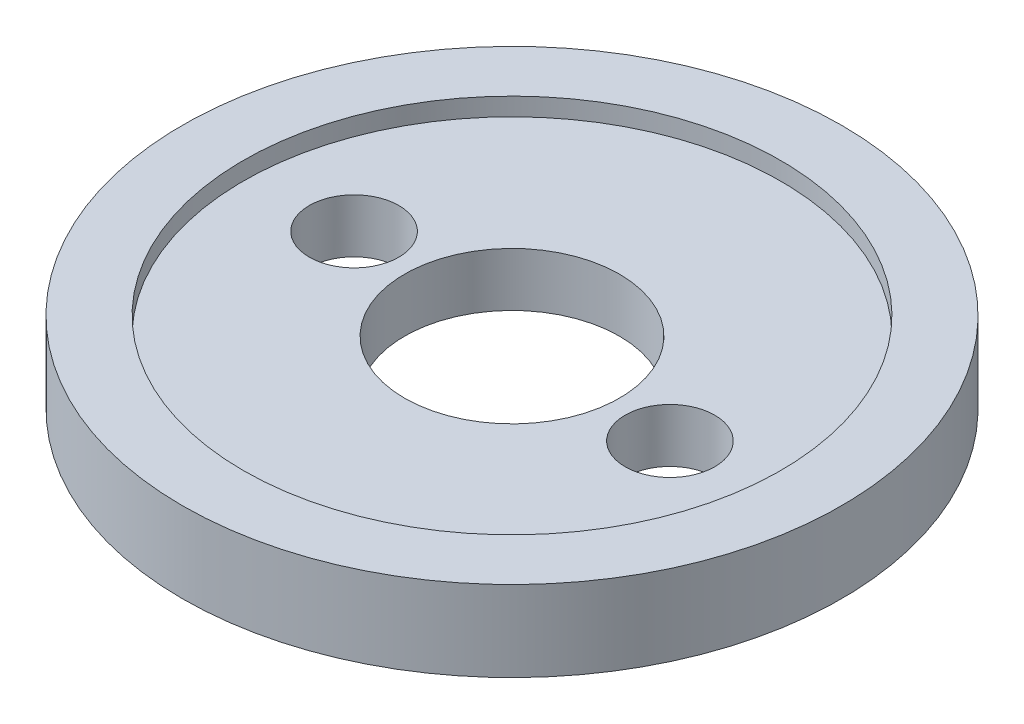
ISO-10303-21;
HEADER;
FILE_DESCRIPTION(('STEP AP214'),'2;1');
FILE_NAME('part.step','',(''),(''),'','','');
FILE_SCHEMA(('AUTOMOTIVE_DESIGN { 1 0 10303 214 1 1 1 1 }'));
ENDSEC;
DATA;
#1=APPLICATION_CONTEXT('core data for automotive mechanical design processes');
#2=APPLICATION_PROTOCOL_DEFINITION('international standard','automotive_design',2000,#1);
#3=PRODUCT_CONTEXT('',#1,'mechanical');
#4=PRODUCT('Part','Part','',(#3));
#5=PRODUCT_RELATED_PRODUCT_CATEGORY('part','',(#4));
#6=PRODUCT_DEFINITION_FORMATION('','',#4);
#7=PRODUCT_DEFINITION_CONTEXT('part definition',#1,'design');
#8=PRODUCT_DEFINITION('design','',#6,#7);
#9=PRODUCT_DEFINITION_SHAPE('','',#8);
#10=(LENGTH_UNIT() NAMED_UNIT(*) SI_UNIT(.MILLI.,.METRE.));
#11=(NAMED_UNIT(*) PLANE_ANGLE_UNIT() SI_UNIT($,.RADIAN.));
#12=(NAMED_UNIT(*) SI_UNIT($,.STERADIAN.) SOLID_ANGLE_UNIT());
#13=UNCERTAINTY_MEASURE_WITH_UNIT(LENGTH_MEASURE(1.E-05),#10,'distance_accuracy_value','');
#14=(GEOMETRIC_REPRESENTATION_CONTEXT(3) GLOBAL_UNCERTAINTY_ASSIGNED_CONTEXT((#13)) GLOBAL_UNIT_ASSIGNED_CONTEXT((#10,
#11,#12)) REPRESENTATION_CONTEXT('',''));
#15=CARTESIAN_POINT('',(0.,0.,0.));
#16=DIRECTION('',(0.,0.,1.));
#17=DIRECTION('',(1.,0.,0.));
#18=AXIS2_PLACEMENT_3D('',#15,#16,#17);
#19=CARTESIAN_POINT('',(-9.47714165919986,4.5,-0.658624302207662));
#20=DIRECTION('',(0.,-1.,0.));
#21=DIRECTION('',(0.,0.,-1.));
#22=AXIS2_PLACEMENT_3D('',#19,#20,#21);
#23=CYLINDRICAL_SURFACE('',#22,2.5);
#24=CARTESIAN_POINT('',(-9.47714165919986,3.5,-0.658624302207662));
#25=DIRECTION('',(0.,1.,0.));
#26=DIRECTION('',(0.,0.,1.));
#27=AXIS2_PLACEMENT_3D('',#24,#25,#26);
#28=CIRCLE('',#27,2.5);
#29=CARTESIAN_POINT('',(-9.47714165919986,3.5,1.84137569779234));
#30=VERTEX_POINT('',#29);
#31=EDGE_CURVE('E50',#30,#30,#28,.T.);
#32=ORIENTED_EDGE('',*,*,#31,.T.);
#33=EDGE_LOOP('',(#32));
#34=FACE_BOUND('',#33,.T.);
#35=CARTESIAN_POINT('',(-9.47714165919986,0.5,-0.658624302207662));
#36=DIRECTION('',(0.,-1.,0.));
#37=DIRECTION('',(0.,0.,-1.));
#38=AXIS2_PLACEMENT_3D('',#35,#36,#37);
#39=CIRCLE('',#38,2.5);
#40=CARTESIAN_POINT('',(-9.47714165919986,0.5,-3.15862430220766));
#41=VERTEX_POINT('',#40);
#42=EDGE_CURVE('E55',#41,#41,#39,.F.);
#43=ORIENTED_EDGE('',*,*,#42,.F.);
#44=EDGE_LOOP('',(#43));
#45=FACE_BOUND('',#44,.T.);
#46=ADVANCED_FACE('F31',(#34,#45),#23,.F.);
#47=CARTESIAN_POINT('',(9.47714165919986,4.5,0.658624302207676));
#48=DIRECTION('',(0.,-1.,0.));
#49=DIRECTION('',(0.,0.,-1.));
#50=AXIS2_PLACEMENT_3D('',#47,#48,#49);
#51=CYLINDRICAL_SURFACE('',#50,2.5);
#52=CARTESIAN_POINT('',(9.47714165919986,3.5,0.658624302207676));
#53=DIRECTION('',(0.,1.,0.));
#54=DIRECTION('',(0.,0.,1.));
#55=AXIS2_PLACEMENT_3D('',#52,#53,#54);
#56=CIRCLE('',#55,2.5);
#57=CARTESIAN_POINT('',(9.47714165919986,3.5,3.15862430220768));
#58=VERTEX_POINT('',#57);
#59=EDGE_CURVE('E53',#58,#58,#56,.T.);
#60=ORIENTED_EDGE('',*,*,#59,.T.);
#61=EDGE_LOOP('',(#60));
#62=FACE_BOUND('',#61,.T.);
#63=CARTESIAN_POINT('',(9.47714165919986,0.5,0.658624302207676));
#64=DIRECTION('',(0.,-1.,0.));
#65=DIRECTION('',(0.,0.,-1.));
#66=AXIS2_PLACEMENT_3D('',#63,#64,#65);
#67=CIRCLE('',#66,2.5);
#68=CARTESIAN_POINT('',(9.47714165919986,0.5,-1.84137569779232));
#69=VERTEX_POINT('',#68);
#70=EDGE_CURVE('E56',#69,#69,#67,.F.);
#71=ORIENTED_EDGE('',*,*,#70,.F.);
#72=EDGE_LOOP('',(#71));
#73=FACE_BOUND('',#72,.T.);
#74=ADVANCED_FACE('F91',(#62,#73),#51,.F.);
#75=CARTESIAN_POINT('',(0.,4.5,0.));
#76=DIRECTION('',(0.,-1.,0.));
#77=DIRECTION('',(0.,0.,-1.));
#78=AXIS2_PLACEMENT_3D('',#75,#76,#77);
#79=CYLINDRICAL_SURFACE('',#78,18.4);
#80=CARTESIAN_POINT('',(0.,4.5,0.));
#81=DIRECTION('',(0.,1.,0.));
#82=DIRECTION('',(0.,0.,1.));
#83=AXIS2_PLACEMENT_3D('',#80,#81,#82);
#84=CIRCLE('',#83,18.4);
#85=CARTESIAN_POINT('',(0.,4.5,18.4));
#86=VERTEX_POINT('',#85);
#87=EDGE_CURVE('E10',#86,#86,#84,.T.);
#88=ORIENTED_EDGE('',*,*,#87,.F.);
#89=EDGE_LOOP('',(#88));
#90=FACE_BOUND('',#89,.T.);
#91=CARTESIAN_POINT('',(0.,0.,0.));
#92=DIRECTION('',(0.,1.,0.));
#93=DIRECTION('',(0.,0.,1.));
#94=AXIS2_PLACEMENT_3D('',#91,#92,#93);
#95=CIRCLE('',#94,18.4);
#96=CARTESIAN_POINT('',(0.,0.,18.4));
#97=VERTEX_POINT('',#96);
#98=EDGE_CURVE('E39',#97,#97,#95,.T.);
#99=ORIENTED_EDGE('',*,*,#98,.T.);
#100=EDGE_LOOP('',(#99));
#101=FACE_BOUND('',#100,.T.);
#102=ADVANCED_FACE('F33',(#90,#101),#79,.T.);
#103=CARTESIAN_POINT('',(0.,4.5,0.));
#104=DIRECTION('',(0.,1.,0.));
#105=DIRECTION('',(0.,0.,1.));
#106=AXIS2_PLACEMENT_3D('',#103,#104,#105);
#107=PLANE('',#106);
#108=CARTESIAN_POINT('',(0.,4.5,0.));
#109=DIRECTION('',(0.,1.,0.));
#110=DIRECTION('',(0.,0.,1.));
#111=AXIS2_PLACEMENT_3D('',#108,#109,#110);
#112=CIRCLE('',#111,15.);
#113=CARTESIAN_POINT('',(0.,4.5,15.));
#114=VERTEX_POINT('',#113);
#115=EDGE_CURVE('E47',#114,#114,#112,.T.);
#116=ORIENTED_EDGE('',*,*,#115,.F.);
#117=EDGE_LOOP('',(#116));
#118=FACE_BOUND('',#117,.T.);
#119=ORIENTED_EDGE('',*,*,#87,.T.);
#120=EDGE_LOOP('',(#119));
#121=FACE_BOUND('',#120,.T.);
#122=ADVANCED_FACE('F80',(#118,#121),#107,.T.);
#123=CARTESIAN_POINT('',(0.,0.,0.));
#124=DIRECTION('',(0.,1.,0.));
#125=DIRECTION('',(0.,0.,1.));
#126=AXIS2_PLACEMENT_3D('',#123,#124,#125);
#127=PLANE('',#126);
#128=CARTESIAN_POINT('',(0.,0.,0.));
#129=DIRECTION('',(0.,-1.,0.));
#130=DIRECTION('',(0.,0.,-1.));
#131=AXIS2_PLACEMENT_3D('',#128,#129,#130);
#132=CIRCLE('',#131,15.);
#133=CARTESIAN_POINT('',(0.,0.,-15.));
#134=VERTEX_POINT('',#133);
#135=EDGE_CURVE('E64',#134,#134,#132,.T.);
#136=ORIENTED_EDGE('',*,*,#135,.F.);
#137=EDGE_LOOP('',(#136));
#138=FACE_BOUND('',#137,.T.);
#139=ORIENTED_EDGE('',*,*,#98,.F.);
#140=EDGE_LOOP('',(#139));
#141=FACE_BOUND('',#140,.T.);
#142=ADVANCED_FACE('F82',(#138,#141),#127,.F.);
#143=CARTESIAN_POINT('',(0.,3.5,0.));
#144=DIRECTION('',(0.,1.,0.));
#145=DIRECTION('',(0.,0.,1.));
#146=AXIS2_PLACEMENT_3D('',#143,#144,#145);
#147=CYLINDRICAL_SURFACE('',#146,15.);
#148=CARTESIAN_POINT('',(0.,3.5,0.));
#149=DIRECTION('',(0.,1.,0.));
#150=DIRECTION('',(0.,0.,1.));
#151=AXIS2_PLACEMENT_3D('',#148,#149,#150);
#152=CIRCLE('',#151,15.);
#153=CARTESIAN_POINT('',(0.,3.5,15.));
#154=VERTEX_POINT('',#153);
#155=EDGE_CURVE('E44',#154,#154,#152,.T.);
#156=ORIENTED_EDGE('',*,*,#155,.F.);
#157=EDGE_LOOP('',(#156));
#158=FACE_BOUND('',#157,.T.);
#159=ORIENTED_EDGE('',*,*,#115,.T.);
#160=EDGE_LOOP('',(#159));
#161=FACE_BOUND('',#160,.T.);
#162=ADVANCED_FACE('F78',(#158,#161),#147,.F.);
#163=CARTESIAN_POINT('',(0.,3.5,0.));
#164=DIRECTION('',(0.,1.,0.));
#165=DIRECTION('',(0.,0.,1.));
#166=AXIS2_PLACEMENT_3D('',#163,#164,#165);
#167=PLANE('',#166);
#168=CARTESIAN_POINT('',(0.,3.5,0.));
#169=DIRECTION('',(0.,1.,0.));
#170=DIRECTION('',(0.,0.,1.));
#171=AXIS2_PLACEMENT_3D('',#168,#169,#170);
#172=CIRCLE('',#171,6.);
#173=CARTESIAN_POINT('',(0.,3.5,6.));
#174=VERTEX_POINT('',#173);
#175=EDGE_CURVE('E71',#174,#174,#172,.T.);
#176=ORIENTED_EDGE('',*,*,#175,.F.);
#177=EDGE_LOOP('',(#176));
#178=FACE_BOUND('',#177,.T.);
#179=ORIENTED_EDGE('',*,*,#59,.F.);
#180=EDGE_LOOP('',(#179));
#181=FACE_BOUND('',#180,.T.);
#182=ORIENTED_EDGE('',*,*,#31,.F.);
#183=EDGE_LOOP('',(#182));
#184=FACE_BOUND('',#183,.T.);
#185=ORIENTED_EDGE('',*,*,#155,.T.);
#186=EDGE_LOOP('',(#185));
#187=FACE_BOUND('',#186,.T.);
#188=ADVANCED_FACE('F106',(#178,#181,#184,#187),#167,.T.);
#189=CARTESIAN_POINT('',(0.,0.5,0.));
#190=DIRECTION('',(0.,-1.,0.));
#191=DIRECTION('',(0.,0.,-1.));
#192=AXIS2_PLACEMENT_3D('',#189,#190,#191);
#193=PLANE('',#192);
#194=CARTESIAN_POINT('',(0.,0.5,0.));
#195=DIRECTION('',(0.,-1.,0.));
#196=DIRECTION('',(0.,0.,-1.));
#197=AXIS2_PLACEMENT_3D('',#194,#195,#196);
#198=CIRCLE('',#197,6.);
#199=CARTESIAN_POINT('',(0.,0.5,6.));
#200=VERTEX_POINT('',#199);
#201=EDGE_CURVE('E35',#200,#200,#198,.T.);
#202=ORIENTED_EDGE('',*,*,#201,.F.);
#203=EDGE_LOOP('',(#202));
#204=FACE_BOUND('',#203,.T.);
#205=ORIENTED_EDGE('',*,*,#70,.T.);
#206=EDGE_LOOP('',(#205));
#207=FACE_BOUND('',#206,.T.);
#208=CARTESIAN_POINT('',(0.,0.5,0.));
#209=DIRECTION('',(0.,-1.,0.));
#210=DIRECTION('',(0.,0.,-1.));
#211=AXIS2_PLACEMENT_3D('',#208,#209,#210);
#212=CIRCLE('',#211,15.);
#213=CARTESIAN_POINT('',(0.,0.5,-15.));
#214=VERTEX_POINT('',#213);
#215=EDGE_CURVE('E58',#214,#214,#212,.T.);
#216=ORIENTED_EDGE('',*,*,#215,.T.);
#217=EDGE_LOOP('',(#216));
#218=FACE_BOUND('',#217,.T.);
#219=ORIENTED_EDGE('',*,*,#42,.T.);
#220=EDGE_LOOP('',(#219));
#221=FACE_BOUND('',#220,.T.);
#222=ADVANCED_FACE('F108',(#204,#207,#218,#221),#193,.T.);
#223=CARTESIAN_POINT('',(0.,0.5,0.));
#224=DIRECTION('',(0.,-1.,0.));
#225=DIRECTION('',(0.,0.,-1.));
#226=AXIS2_PLACEMENT_3D('',#223,#224,#225);
#227=CYLINDRICAL_SURFACE('',#226,15.);
#228=ORIENTED_EDGE('',*,*,#215,.F.);
#229=EDGE_LOOP('',(#228));
#230=FACE_BOUND('',#229,.T.);
#231=ORIENTED_EDGE('',*,*,#135,.T.);
#232=EDGE_LOOP('',(#231));
#233=FACE_BOUND('',#232,.T.);
#234=ADVANCED_FACE('F126',(#230,#233),#227,.F.);
#235=CARTESIAN_POINT('',(0.,0.,0.));
#236=DIRECTION('',(0.,1.,0.));
#237=DIRECTION('',(0.,0.,1.));
#238=AXIS2_PLACEMENT_3D('',#235,#236,#237);
#239=CYLINDRICAL_SURFACE('',#238,6.);
#240=CARTESIAN_POINT('',(0.,0.5,6.));
#241=CARTESIAN_POINT('',(0.,0.53125,6.));
#242=CARTESIAN_POINT('',(0.,0.5625,6.));
#243=CARTESIAN_POINT('',(0.,0.625,6.));
#244=CARTESIAN_POINT('',(0.,0.65625,6.));
#245=CARTESIAN_POINT('',(0.,0.71875,6.));
#246=CARTESIAN_POINT('',(0.,0.75,6.));
#247=CARTESIAN_POINT('',(0.,0.8125,6.));
#248=CARTESIAN_POINT('',(0.,0.84375,6.));
#249=CARTESIAN_POINT('',(0.,0.90625,6.));
#250=CARTESIAN_POINT('',(0.,0.9375,6.));
#251=CARTESIAN_POINT('',(0.,1.,6.));
#252=CARTESIAN_POINT('',(0.,1.03125,6.));
#253=CARTESIAN_POINT('',(0.,1.09375,6.));
#254=CARTESIAN_POINT('',(0.,1.125,6.));
#255=CARTESIAN_POINT('',(0.,1.1875,6.));
#256=CARTESIAN_POINT('',(0.,1.21875,6.));
#257=CARTESIAN_POINT('',(0.,1.28125,6.));
#258=CARTESIAN_POINT('',(0.,1.3125,6.));
#259=CARTESIAN_POINT('',(0.,1.375,6.));
#260=CARTESIAN_POINT('',(0.,1.40625,6.));
#261=CARTESIAN_POINT('',(0.,1.46875,6.));
#262=CARTESIAN_POINT('',(0.,1.5,6.));
#263=CARTESIAN_POINT('',(0.,1.5625,6.));
#264=CARTESIAN_POINT('',(0.,1.59375,6.));
#265=CARTESIAN_POINT('',(0.,1.65625,6.));
#266=CARTESIAN_POINT('',(0.,1.6875,6.));
#267=CARTESIAN_POINT('',(0.,1.75,6.));
#268=CARTESIAN_POINT('',(0.,1.78125,6.));
#269=CARTESIAN_POINT('',(0.,1.84375,6.));
#270=CARTESIAN_POINT('',(0.,1.875,6.));
#271=CARTESIAN_POINT('',(0.,1.9375,6.));
#272=CARTESIAN_POINT('',(0.,1.96875,6.));
#273=CARTESIAN_POINT('',(0.,2.03125,6.));
#274=CARTESIAN_POINT('',(0.,2.0625,6.));
#275=CARTESIAN_POINT('',(0.,2.125,6.));
#276=CARTESIAN_POINT('',(0.,2.15625,6.));
#277=CARTESIAN_POINT('',(0.,2.21875,6.));
#278=CARTESIAN_POINT('',(0.,2.25,6.));
#279=CARTESIAN_POINT('',(0.,2.3125,6.));
#280=CARTESIAN_POINT('',(0.,2.34375,6.));
#281=CARTESIAN_POINT('',(0.,2.40625,6.));
#282=CARTESIAN_POINT('',(0.,2.4375,6.));
#283=CARTESIAN_POINT('',(0.,2.5,6.));
#284=CARTESIAN_POINT('',(0.,2.53125,6.));
#285=CARTESIAN_POINT('',(0.,2.59375,6.));
#286=CARTESIAN_POINT('',(0.,2.625,6.));
#287=CARTESIAN_POINT('',(0.,2.6875,6.));
#288=CARTESIAN_POINT('',(0.,2.71875,6.));
#289=CARTESIAN_POINT('',(0.,2.78125,6.));
#290=CARTESIAN_POINT('',(0.,2.8125,6.));
#291=CARTESIAN_POINT('',(0.,2.875,6.));
#292=CARTESIAN_POINT('',(0.,2.90625,6.));
#293=CARTESIAN_POINT('',(0.,2.96875,6.));
#294=CARTESIAN_POINT('',(0.,3.,6.));
#295=CARTESIAN_POINT('',(0.,3.0625,6.));
#296=CARTESIAN_POINT('',(0.,3.09375,6.));
#297=CARTESIAN_POINT('',(0.,3.15625,6.));
#298=CARTESIAN_POINT('',(0.,3.1875,6.));
#299=CARTESIAN_POINT('',(0.,3.25,6.));
#300=CARTESIAN_POINT('',(0.,3.28125,6.));
#301=CARTESIAN_POINT('',(0.,3.34375,6.));
#302=CARTESIAN_POINT('',(0.,3.375,6.));
#303=CARTESIAN_POINT('',(0.,3.4375,6.));
#304=CARTESIAN_POINT('',(0.,3.46875,6.));
#305=CARTESIAN_POINT('',(0.,3.5,6.));
#306=B_SPLINE_CURVE_WITH_KNOTS('',3,(#240,#241,#242,#243,#244,#245,#246,#247,#248,#249,#250,
#251,#252,#253,#254,#255,#256,#257,#258,#259,#260,#261,#262,#263,#264,#265,#266,#267,#268,#269,
#270,#271,#272,#273,#274,#275,#276,#277,#278,#279,#280,#281,#282,#283,#284,#285,#286,#287,#288,
#289,#290,#291,#292,#293,#294,#295,#296,#297,#298,#299,#300,#301,#302,#303,#304,#305),
.UNSPECIFIED.,.F.,.F.,(4,2,2,2,2,2,2,2,2,2,2,2,2,2,2,2,2,2,2,2,2,2,2,2,2,2,2,2,2,2,2,2,4),(0.,
0.09375,0.1875,0.28125,0.375,0.46875,0.5625,0.65625,0.75,0.84375,0.9375,1.03125,1.125,1.21875,
1.3125,1.40625,1.5,1.59375,1.6875,1.78125,1.875,1.96875,2.0625,2.15625,2.25,2.34375,2.4375,
2.53125,2.625,2.71875,2.8125,2.90625,3.),.UNSPECIFIED.);
#307=EDGE_CURVE('BSEAM134',#200,#174,#306,.T.);
#308=ORIENTED_EDGE('',*,*,#201,.T.);
#309=ORIENTED_EDGE('',*,*,#175,.T.);
#310=ORIENTED_EDGE('',*,*,#307,.T.);
#311=ORIENTED_EDGE('',*,*,#307,.F.);
#312=EDGE_LOOP('',(#308,#310,#309,#311));
#313=FACE_BOUND('',#312,.T.);
#314=ADVANCED_FACE('F134',(#313),#239,.F.);
#315=CLOSED_SHELL('',(#46,#74,#102,#122,#142,#162,#188,#222,#234,#314));
#316=MANIFOLD_SOLID_BREP('B2',#315);
#317=ADVANCED_BREP_SHAPE_REPRESENTATION('',(#18,#316),#14);
#318=SHAPE_DEFINITION_REPRESENTATION(#9,#317);
ENDSEC;
END-ISO-10303-21;
